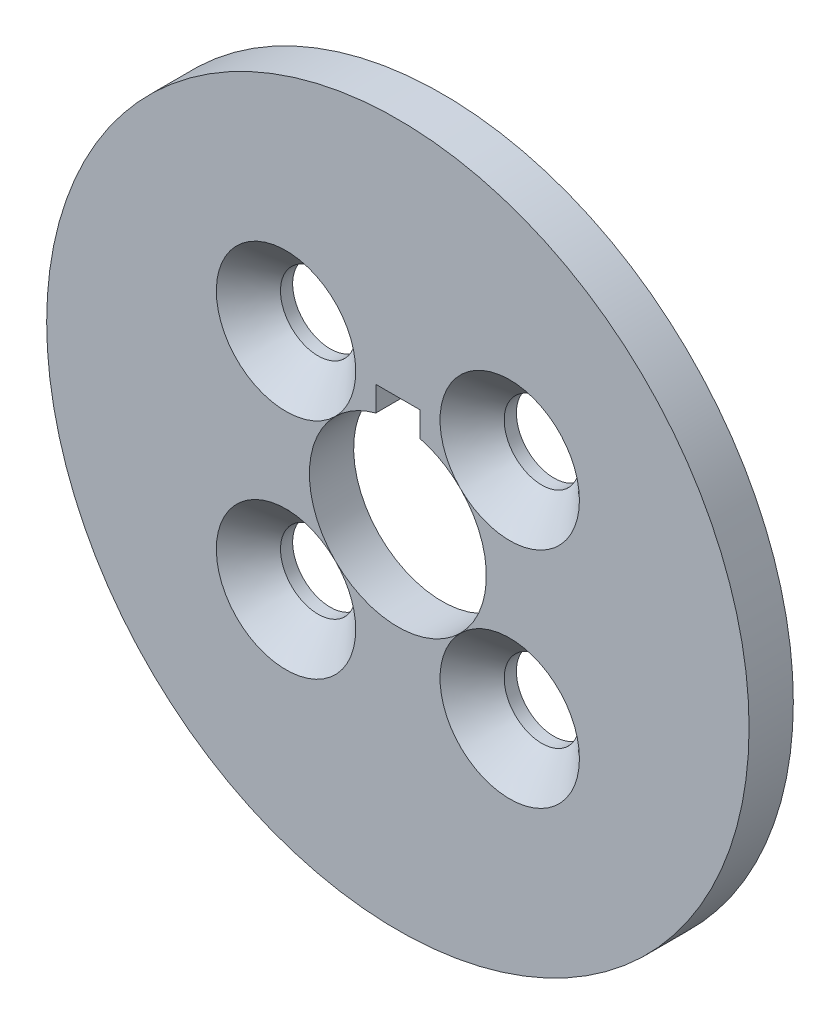
ISO-10303-21;
HEADER;
FILE_DESCRIPTION(('STEP AP214'),'2;1');
FILE_NAME('part.step','',(''),(''),'','','');
FILE_SCHEMA(('AUTOMOTIVE_DESIGN { 1 0 10303 214 1 1 1 1 }'));
ENDSEC;
DATA;
#1=APPLICATION_CONTEXT('core data for automotive mechanical design processes');
#2=APPLICATION_PROTOCOL_DEFINITION('international standard','automotive_design',2000,#1);
#3=PRODUCT_CONTEXT('',#1,'mechanical');
#4=PRODUCT('Part','Part','',(#3));
#5=PRODUCT_RELATED_PRODUCT_CATEGORY('part','',(#4));
#6=PRODUCT_DEFINITION_FORMATION('','',#4);
#7=PRODUCT_DEFINITION_CONTEXT('part definition',#1,'design');
#8=PRODUCT_DEFINITION('design','',#6,#7);
#9=PRODUCT_DEFINITION_SHAPE('','',#8);
#10=(LENGTH_UNIT() NAMED_UNIT(*) SI_UNIT(.MILLI.,.METRE.));
#11=(NAMED_UNIT(*) PLANE_ANGLE_UNIT() SI_UNIT($,.RADIAN.));
#12=(NAMED_UNIT(*) SI_UNIT($,.STERADIAN.) SOLID_ANGLE_UNIT());
#13=UNCERTAINTY_MEASURE_WITH_UNIT(LENGTH_MEASURE(1.E-05),#10,'distance_accuracy_value','');
#14=(GEOMETRIC_REPRESENTATION_CONTEXT(3) GLOBAL_UNCERTAINTY_ASSIGNED_CONTEXT((#13)) GLOBAL_UNIT_ASSIGNED_CONTEXT((#10,
#11,#12)) REPRESENTATION_CONTEXT('',''));
#15=CARTESIAN_POINT('',(0.,0.,0.));
#16=DIRECTION('',(0.,0.,1.));
#17=DIRECTION('',(1.,0.,0.));
#18=AXIS2_PLACEMENT_3D('',#15,#16,#17);
#19=CARTESIAN_POINT('',(-160.606756626317,98.8856314828036,2.));
#20=DIRECTION('',(0.,0.,-1.));
#21=DIRECTION('',(-1.,0.,0.));
#22=AXIS2_PLACEMENT_3D('',#19,#20,#21);
#23=CYLINDRICAL_SURFACE('',#22,15.875);
#24=CARTESIAN_POINT('',(-160.606756626317,98.8856314828036,2.));
#25=DIRECTION('',(0.,0.,-1.));
#26=DIRECTION('',(-1.,0.,0.));
#27=AXIS2_PLACEMENT_3D('',#24,#25,#26);
#28=CIRCLE('',#27,15.875);
#29=CARTESIAN_POINT('',(-176.481756626317,98.8856314828036,2.));
#30=VERTEX_POINT('',#29);
#31=EDGE_CURVE('E11',#30,#30,#28,.T.);
#32=ORIENTED_EDGE('',*,*,#31,.T.);
#33=EDGE_LOOP('',(#32));
#34=FACE_BOUND('',#33,.T.);
#35=CARTESIAN_POINT('',(-160.606756626317,98.8856314828036,0.));
#36=DIRECTION('',(0.,0.,-1.));
#37=DIRECTION('',(-1.,0.,0.));
#38=AXIS2_PLACEMENT_3D('',#35,#36,#37);
#39=CIRCLE('',#38,15.875);
#40=CARTESIAN_POINT('',(-176.481756626317,98.8856314828036,0.));
#41=VERTEX_POINT('',#40);
#42=EDGE_CURVE('E48',#41,#41,#39,.T.);
#43=ORIENTED_EDGE('',*,*,#42,.F.);
#44=EDGE_LOOP('',(#43));
#45=FACE_BOUND('',#44,.T.);
#46=ADVANCED_FACE('F40',(#34,#45),#23,.T.);
#47=CARTESIAN_POINT('',(-144.731756626317,98.8856314828036,2.));
#48=DIRECTION('',(0.,0.,1.));
#49=DIRECTION('',(1.,0.,0.));
#50=AXIS2_PLACEMENT_3D('',#47,#48,#49);
#51=PLANE('',#50);
#52=CARTESIAN_POINT('',(-160.606756626317,98.8856314828036,2.));
#53=DIRECTION('',(0.,0.,1.));
#54=DIRECTION('',(1.,0.,0.));
#55=AXIS2_PLACEMENT_3D('',#52,#53,#54);
#56=CIRCLE('',#55,4.);
#57=CARTESIAN_POINT('',(-163.435183751062,101.714058607551,2.));
#58=VERTEX_POINT('',#57);
#59=CARTESIAN_POINT('',(-163.435183751064,96.0572043580585,2.));
#60=VERTEX_POINT('',#59);
#61=EDGE_CURVE('E115',#58,#60,#56,.T.);
#62=ORIENTED_EDGE('',*,*,#61,.F.);
#63=CARTESIAN_POINT('',(-165.662570111801,103.941444968287,2.));
#64=DIRECTION('',(0.,0.,1.));
#65=DIRECTION('',(1.,0.,0.));
#66=AXIS2_PLACEMENT_3D('',#63,#64,#65);
#67=CIRCLE('',#66,3.15000000000001);
#68=EDGE_CURVE('E56',#58,#58,#67,.T.);
#69=ORIENTED_EDGE('',*,*,#68,.F.);
#70=CARTESIAN_POINT('',(-161.606756626317,102.758614829011,2.));
#71=VERTEX_POINT('',#70);
#72=EDGE_CURVE('E98',#71,#58,#56,.T.);
#73=ORIENTED_EDGE('',*,*,#72,.F.);
#74=DIRECTION('',(0.,1.,0.));
#75=VECTOR('',#74,1.);
#76=CARTESIAN_POINT('',(-161.606756626317,102.758614829011,2.));
#77=LINE('',#76,#75);
#78=CARTESIAN_POINT('',(-161.606756626317,103.885631482804,2.));
#79=VERTEX_POINT('',#78);
#80=EDGE_CURVE('E113',#71,#79,#77,.T.);
#81=ORIENTED_EDGE('',*,*,#80,.T.);
#82=DIRECTION('',(1.,0.,0.));
#83=VECTOR('',#82,1.);
#84=CARTESIAN_POINT('',(-161.606756626317,103.885631482804,2.));
#85=LINE('',#84,#83);
#86=CARTESIAN_POINT('',(-159.606756626317,103.885631482804,2.));
#87=VERTEX_POINT('',#86);
#88=EDGE_CURVE('E123',#79,#87,#85,.T.);
#89=ORIENTED_EDGE('',*,*,#88,.T.);
#90=DIRECTION('',(0.,-1.,0.));
#91=VECTOR('',#90,1.);
#92=CARTESIAN_POINT('',(-159.606756626317,103.885631482804,2.));
#93=LINE('',#92,#91);
#94=CARTESIAN_POINT('',(-159.606756626317,102.758614829011,2.));
#95=VERTEX_POINT('',#94);
#96=EDGE_CURVE('E129',#87,#95,#93,.T.);
#97=ORIENTED_EDGE('',*,*,#96,.T.);
#98=CARTESIAN_POINT('',(-157.77832950157,101.714058607549,2.));
#99=VERTEX_POINT('',#98);
#100=EDGE_CURVE('E261',#99,#95,#56,.T.);
#101=ORIENTED_EDGE('',*,*,#100,.F.);
#102=CARTESIAN_POINT('',(-155.550943140833,103.941444968288,2.));
#103=DIRECTION('',(0.,0.,1.));
#104=DIRECTION('',(1.,0.,0.));
#105=AXIS2_PLACEMENT_3D('',#102,#103,#104);
#106=CIRCLE('',#105,3.14999999999999);
#107=EDGE_CURVE('E61',#99,#99,#106,.T.);
#108=ORIENTED_EDGE('',*,*,#107,.F.);
#109=CARTESIAN_POINT('',(-157.778329501572,96.0572043580567,2.));
#110=VERTEX_POINT('',#109);
#111=EDGE_CURVE('E266',#110,#99,#56,.T.);
#112=ORIENTED_EDGE('',*,*,#111,.F.);
#113=CARTESIAN_POINT('',(-155.550943140833,93.82981799732,2.));
#114=DIRECTION('',(0.,0.,1.));
#115=DIRECTION('',(1.,0.,0.));
#116=AXIS2_PLACEMENT_3D('',#113,#114,#115);
#117=CIRCLE('',#116,3.14999999999999);
#118=EDGE_CURVE('E239',#110,#110,#117,.T.);
#119=ORIENTED_EDGE('',*,*,#118,.F.);
#120=EDGE_CURVE('E117',#60,#110,#56,.T.);
#121=ORIENTED_EDGE('',*,*,#120,.F.);
#122=CARTESIAN_POINT('',(-165.662570111801,93.8298179973198,2.));
#123=DIRECTION('',(0.,0.,1.));
#124=DIRECTION('',(1.,0.,0.));
#125=AXIS2_PLACEMENT_3D('',#122,#123,#124);
#126=CIRCLE('',#125,3.15000000000001);
#127=EDGE_CURVE('E250',#60,#60,#126,.T.);
#128=ORIENTED_EDGE('',*,*,#127,.F.);
#129=EDGE_LOOP('',(#62,#69,#73,#81,#89,#97,#101,#108,#112,#119,#121,#128));
#130=FACE_BOUND('',#129,.T.);
#131=ORIENTED_EDGE('',*,*,#31,.F.);
#132=EDGE_LOOP('',(#131));
#133=FACE_BOUND('',#132,.T.);
#134=ADVANCED_FACE('F110',(#130,#133),#51,.T.);
#135=CARTESIAN_POINT('',(-160.606756626317,98.8856314828036,0.));
#136=DIRECTION('',(0.,0.,-1.));
#137=DIRECTION('',(-1.,0.,0.));
#138=AXIS2_PLACEMENT_3D('',#135,#136,#137);
#139=PLANE('',#138);
#140=CARTESIAN_POINT('',(-165.662570111801,103.941444968287,0.));
#141=DIRECTION('',(0.,0.,1.));
#142=DIRECTION('',(1.,0.,0.));
#143=AXIS2_PLACEMENT_3D('',#140,#141,#142);
#144=CIRCLE('',#143,1.70000000000001);
#145=CARTESIAN_POINT('',(-163.9625701118,103.941444968287,0.));
#146=VERTEX_POINT('',#145);
#147=EDGE_CURVE('E220',#146,#146,#144,.T.);
#148=ORIENTED_EDGE('',*,*,#147,.T.);
#149=EDGE_LOOP('',(#148));
#150=FACE_BOUND('',#149,.T.);
#151=CARTESIAN_POINT('',(-155.550943140833,103.941444968288,0.));
#152=DIRECTION('',(0.,0.,1.));
#153=DIRECTION('',(1.,0.,0.));
#154=AXIS2_PLACEMENT_3D('',#151,#152,#153);
#155=CIRCLE('',#154,1.70000000000001);
#156=CARTESIAN_POINT('',(-153.850943140833,103.941444968288,0.));
#157=VERTEX_POINT('',#156);
#158=EDGE_CURVE('E235',#157,#157,#155,.T.);
#159=ORIENTED_EDGE('',*,*,#158,.T.);
#160=EDGE_LOOP('',(#159));
#161=FACE_BOUND('',#160,.T.);
#162=CARTESIAN_POINT('',(-155.550943140833,93.82981799732,0.));
#163=DIRECTION('',(0.,0.,1.));
#164=DIRECTION('',(1.,0.,0.));
#165=AXIS2_PLACEMENT_3D('',#162,#163,#164);
#166=CIRCLE('',#165,1.70000000000001);
#167=CARTESIAN_POINT('',(-153.850943140832,93.82981799732,0.));
#168=VERTEX_POINT('',#167);
#169=EDGE_CURVE('E246',#168,#168,#166,.T.);
#170=ORIENTED_EDGE('',*,*,#169,.T.);
#171=EDGE_LOOP('',(#170));
#172=FACE_BOUND('',#171,.T.);
#173=CARTESIAN_POINT('',(-165.662570111801,93.8298179973198,0.));
#174=DIRECTION('',(0.,0.,1.));
#175=DIRECTION('',(1.,0.,0.));
#176=AXIS2_PLACEMENT_3D('',#173,#174,#175);
#177=CIRCLE('',#176,1.70000000000001);
#178=CARTESIAN_POINT('',(-163.9625701118,93.8298179973198,0.));
#179=VERTEX_POINT('',#178);
#180=EDGE_CURVE('E258',#179,#179,#177,.T.);
#181=ORIENTED_EDGE('',*,*,#180,.T.);
#182=EDGE_LOOP('',(#181));
#183=FACE_BOUND('',#182,.T.);
#184=CARTESIAN_POINT('',(-160.606756626317,98.8856314828036,0.));
#185=DIRECTION('',(0.,0.,1.));
#186=DIRECTION('',(1.,0.,0.));
#187=AXIS2_PLACEMENT_3D('',#184,#185,#186);
#188=CIRCLE('',#187,4.);
#189=CARTESIAN_POINT('',(-161.606756626317,102.758614829011,0.));
#190=VERTEX_POINT('',#189);
#191=CARTESIAN_POINT('',(-159.606756626317,102.758614829011,0.));
#192=VERTEX_POINT('',#191);
#193=EDGE_CURVE('E100',#190,#192,#188,.T.);
#194=ORIENTED_EDGE('',*,*,#193,.T.);
#195=DIRECTION('',(0.,-1.,0.));
#196=VECTOR('',#195,1.);
#197=CARTESIAN_POINT('',(-159.606756626317,103.885631482804,0.));
#198=LINE('',#197,#196);
#199=CARTESIAN_POINT('',(-159.606756626317,103.885631482804,0.));
#200=VERTEX_POINT('',#199);
#201=EDGE_CURVE('E124',#200,#192,#198,.T.);
#202=ORIENTED_EDGE('',*,*,#201,.F.);
#203=DIRECTION('',(1.,0.,0.));
#204=VECTOR('',#203,1.);
#205=CARTESIAN_POINT('',(-161.606756626317,103.885631482804,0.));
#206=LINE('',#205,#204);
#207=CARTESIAN_POINT('',(-161.606756626317,103.885631482804,0.));
#208=VERTEX_POINT('',#207);
#209=EDGE_CURVE('E132',#208,#200,#206,.T.);
#210=ORIENTED_EDGE('',*,*,#209,.F.);
#211=DIRECTION('',(0.,1.,0.));
#212=VECTOR('',#211,1.);
#213=CARTESIAN_POINT('',(-161.606756626317,102.758614829011,0.));
#214=LINE('',#213,#212);
#215=EDGE_CURVE('E139',#190,#208,#214,.T.);
#216=ORIENTED_EDGE('',*,*,#215,.F.);
#217=EDGE_LOOP('',(#194,#202,#210,#216));
#218=FACE_BOUND('',#217,.T.);
#219=ORIENTED_EDGE('',*,*,#42,.T.);
#220=EDGE_LOOP('',(#219));
#221=FACE_BOUND('',#220,.T.);
#222=ADVANCED_FACE('F156',(#150,#161,#172,#183,#218,#221),#139,.T.);
#223=CARTESIAN_POINT('',(-161.606756626317,102.758614829011,2.));
#224=DIRECTION('',(-1.,0.,0.));
#225=DIRECTION('',(0.,0.,1.));
#226=AXIS2_PLACEMENT_3D('',#223,#224,#225);
#227=PLANE('',#226);
#228=ORIENTED_EDGE('',*,*,#215,.T.);
#229=DIRECTION('',(0.,0.,-1.));
#230=VECTOR('',#229,1.);
#231=CARTESIAN_POINT('',(-161.606756626317,103.885631482804,2.));
#232=LINE('',#231,#230);
#233=EDGE_CURVE('E120',#79,#208,#232,.T.);
#234=ORIENTED_EDGE('',*,*,#233,.F.);
#235=ORIENTED_EDGE('',*,*,#80,.F.);
#236=DIRECTION('',(0.,0.,-1.));
#237=VECTOR('',#236,1.);
#238=CARTESIAN_POINT('',(-161.606756626317,102.758614829011,2.));
#239=LINE('',#238,#237);
#240=EDGE_CURVE('E95',#71,#190,#239,.T.);
#241=ORIENTED_EDGE('',*,*,#240,.T.);
#242=EDGE_LOOP('',(#228,#234,#235,#241));
#243=FACE_BOUND('',#242,.T.);
#244=ADVANCED_FACE('F118',(#243),#227,.F.);
#245=CARTESIAN_POINT('',(-159.606756626317,103.885631482804,2.));
#246=DIRECTION('',(1.,0.,0.));
#247=DIRECTION('',(0.,0.,-1.));
#248=AXIS2_PLACEMENT_3D('',#245,#246,#247);
#249=PLANE('',#248);
#250=ORIENTED_EDGE('',*,*,#201,.T.);
#251=DIRECTION('',(0.,0.,-1.));
#252=VECTOR('',#251,1.);
#253=CARTESIAN_POINT('',(-159.606756626317,102.758614829011,2.));
#254=LINE('',#253,#252);
#255=EDGE_CURVE('E105',#95,#192,#254,.T.);
#256=ORIENTED_EDGE('',*,*,#255,.F.);
#257=ORIENTED_EDGE('',*,*,#96,.F.);
#258=DIRECTION('',(0.,0.,-1.));
#259=VECTOR('',#258,1.);
#260=CARTESIAN_POINT('',(-159.606756626317,103.885631482804,2.));
#261=LINE('',#260,#259);
#262=EDGE_CURVE('E147',#87,#200,#261,.T.);
#263=ORIENTED_EDGE('',*,*,#262,.T.);
#264=EDGE_LOOP('',(#250,#256,#257,#263));
#265=FACE_BOUND('',#264,.T.);
#266=ADVANCED_FACE('F172',(#265),#249,.F.);
#267=CARTESIAN_POINT('',(-161.606756626317,103.885631482804,2.));
#268=DIRECTION('',(0.,1.,0.));
#269=DIRECTION('',(0.,0.,1.));
#270=AXIS2_PLACEMENT_3D('',#267,#268,#269);
#271=PLANE('',#270);
#272=ORIENTED_EDGE('',*,*,#209,.T.);
#273=ORIENTED_EDGE('',*,*,#262,.F.);
#274=ORIENTED_EDGE('',*,*,#88,.F.);
#275=ORIENTED_EDGE('',*,*,#233,.T.);
#276=EDGE_LOOP('',(#272,#273,#274,#275));
#277=FACE_BOUND('',#276,.T.);
#278=ADVANCED_FACE('F173',(#277),#271,.F.);
#279=CARTESIAN_POINT('',(-160.606756626317,98.8856314828036,0.));
#280=DIRECTION('',(0.,0.,1.));
#281=DIRECTION('',(1.,0.,0.));
#282=AXIS2_PLACEMENT_3D('',#279,#280,#281);
#283=CYLINDRICAL_SURFACE('',#282,4.);
#284=ORIENTED_EDGE('',*,*,#72,.T.);
#285=ORIENTED_EDGE('',*,*,#61,.T.);
#286=ORIENTED_EDGE('',*,*,#120,.T.);
#287=ORIENTED_EDGE('',*,*,#111,.T.);
#288=ORIENTED_EDGE('',*,*,#100,.T.);
#289=ORIENTED_EDGE('',*,*,#255,.T.);
#290=ORIENTED_EDGE('',*,*,#193,.F.);
#291=ORIENTED_EDGE('',*,*,#240,.F.);
#292=EDGE_LOOP('',(#284,#285,#286,#287,#288,#289,#290,#291));
#293=FACE_BOUND('',#292,.T.);
#294=ADVANCED_FACE('F97',(#293),#283,.F.);
#295=CARTESIAN_POINT('',(-165.662570111801,93.8298179973198,2.));
#296=DIRECTION('',(0.,0.,1.));
#297=DIRECTION('',(1.,0.,0.));
#298=AXIS2_PLACEMENT_3D('',#295,#296,#297);
#299=CYLINDRICAL_SURFACE('',#298,1.70000000000001);
#300=ORIENTED_EDGE('',*,*,#180,.F.);
#301=EDGE_LOOP('',(#300));
#302=FACE_BOUND('',#301,.T.);
#303=CARTESIAN_POINT('',(-165.662570111801,93.8298179973198,0.550000000000001));
#304=DIRECTION('',(0.,0.,1.));
#305=DIRECTION('',(1.,0.,0.));
#306=AXIS2_PLACEMENT_3D('',#303,#304,#305);
#307=CIRCLE('',#306,1.70000000000001);
#308=CARTESIAN_POINT('',(-163.9625701118,93.8298179973198,0.550000000000001));
#309=VERTEX_POINT('',#308);
#310=EDGE_CURVE('E254',#309,#309,#307,.T.);
#311=ORIENTED_EDGE('',*,*,#310,.T.);
#312=EDGE_LOOP('',(#311));
#313=FACE_BOUND('',#312,.T.);
#314=ADVANCED_FACE('F182',(#302,#313),#299,.F.);
#315=CARTESIAN_POINT('',(-165.662570111801,93.8298179973198,2.));
#316=DIRECTION('',(0.,0.,1.));
#317=DIRECTION('',(1.,0.,0.));
#318=AXIS2_PLACEMENT_3D('',#315,#316,#317);
#319=CONICAL_SURFACE('',#318,3.15000000000001,0.785398163397451);
#320=ORIENTED_EDGE('',*,*,#310,.F.);
#321=EDGE_LOOP('',(#320));
#322=FACE_BOUND('',#321,.T.);
#323=ORIENTED_EDGE('',*,*,#127,.T.);
#324=EDGE_LOOP('',(#323));
#325=FACE_BOUND('',#324,.T.);
#326=ADVANCED_FACE('F185',(#322,#325),#319,.F.);
#327=CARTESIAN_POINT('',(-155.550943140833,93.82981799732,2.));
#328=DIRECTION('',(0.,0.,1.));
#329=DIRECTION('',(1.,0.,0.));
#330=AXIS2_PLACEMENT_3D('',#327,#328,#329);
#331=CYLINDRICAL_SURFACE('',#330,1.70000000000001);
#332=ORIENTED_EDGE('',*,*,#169,.F.);
#333=EDGE_LOOP('',(#332));
#334=FACE_BOUND('',#333,.T.);
#335=CARTESIAN_POINT('',(-155.550943140833,93.82981799732,0.550000000000001));
#336=DIRECTION('',(0.,0.,1.));
#337=DIRECTION('',(1.,0.,0.));
#338=AXIS2_PLACEMENT_3D('',#335,#336,#337);
#339=CIRCLE('',#338,1.70000000000001);
#340=CARTESIAN_POINT('',(-153.850943140832,93.82981799732,0.550000000000001));
#341=VERTEX_POINT('',#340);
#342=EDGE_CURVE('E242',#341,#341,#339,.T.);
#343=ORIENTED_EDGE('',*,*,#342,.T.);
#344=EDGE_LOOP('',(#343));
#345=FACE_BOUND('',#344,.T.);
#346=ADVANCED_FACE('F189',(#334,#345),#331,.F.);
#347=CARTESIAN_POINT('',(-155.550943140833,93.82981799732,2.));
#348=DIRECTION('',(0.,0.,1.));
#349=DIRECTION('',(1.,0.,0.));
#350=AXIS2_PLACEMENT_3D('',#347,#348,#349);
#351=CONICAL_SURFACE('',#350,3.14999999999999,0.785398163397442);
#352=ORIENTED_EDGE('',*,*,#342,.F.);
#353=EDGE_LOOP('',(#352));
#354=FACE_BOUND('',#353,.T.);
#355=ORIENTED_EDGE('',*,*,#118,.T.);
#356=EDGE_LOOP('',(#355));
#357=FACE_BOUND('',#356,.T.);
#358=ADVANCED_FACE('F193',(#354,#357),#351,.F.);
#359=CARTESIAN_POINT('',(-155.550943140833,103.941444968288,2.));
#360=DIRECTION('',(0.,0.,1.));
#361=DIRECTION('',(1.,0.,0.));
#362=AXIS2_PLACEMENT_3D('',#359,#360,#361);
#363=CYLINDRICAL_SURFACE('',#362,1.70000000000001);
#364=ORIENTED_EDGE('',*,*,#158,.F.);
#365=EDGE_LOOP('',(#364));
#366=FACE_BOUND('',#365,.T.);
#367=CARTESIAN_POINT('',(-155.550943140833,103.941444968288,0.550000000000001));
#368=DIRECTION('',(0.,0.,1.));
#369=DIRECTION('',(1.,0.,0.));
#370=AXIS2_PLACEMENT_3D('',#367,#368,#369);
#371=CIRCLE('',#370,1.70000000000001);
#372=CARTESIAN_POINT('',(-153.850943140833,103.941444968288,0.550000000000001));
#373=VERTEX_POINT('',#372);
#374=EDGE_CURVE('E231',#373,#373,#371,.T.);
#375=ORIENTED_EDGE('',*,*,#374,.T.);
#376=EDGE_LOOP('',(#375));
#377=FACE_BOUND('',#376,.T.);
#378=ADVANCED_FACE('F197',(#366,#377),#363,.F.);
#379=CARTESIAN_POINT('',(-155.550943140833,103.941444968288,2.));
#380=DIRECTION('',(0.,0.,1.));
#381=DIRECTION('',(1.,0.,0.));
#382=AXIS2_PLACEMENT_3D('',#379,#380,#381);
#383=CONICAL_SURFACE('',#382,3.14999999999999,0.785398163397442);
#384=ORIENTED_EDGE('',*,*,#374,.F.);
#385=EDGE_LOOP('',(#384));
#386=FACE_BOUND('',#385,.T.);
#387=ORIENTED_EDGE('',*,*,#107,.T.);
#388=EDGE_LOOP('',(#387));
#389=FACE_BOUND('',#388,.T.);
#390=ADVANCED_FACE('F201',(#386,#389),#383,.F.);
#391=CARTESIAN_POINT('',(-165.662570111801,103.941444968287,2.));
#392=DIRECTION('',(0.,0.,1.));
#393=DIRECTION('',(1.,0.,0.));
#394=AXIS2_PLACEMENT_3D('',#391,#392,#393);
#395=CYLINDRICAL_SURFACE('',#394,1.70000000000001);
#396=ORIENTED_EDGE('',*,*,#147,.F.);
#397=EDGE_LOOP('',(#396));
#398=FACE_BOUND('',#397,.T.);
#399=CARTESIAN_POINT('',(-165.662570111801,103.941444968287,0.550000000000001));
#400=DIRECTION('',(0.,0.,1.));
#401=DIRECTION('',(1.,0.,0.));
#402=AXIS2_PLACEMENT_3D('',#399,#400,#401);
#403=CIRCLE('',#402,1.70000000000001);
#404=CARTESIAN_POINT('',(-163.9625701118,103.941444968287,0.550000000000001));
#405=VERTEX_POINT('',#404);
#406=EDGE_CURVE('E217',#405,#405,#403,.T.);
#407=ORIENTED_EDGE('',*,*,#406,.T.);
#408=EDGE_LOOP('',(#407));
#409=FACE_BOUND('',#408,.T.);
#410=ADVANCED_FACE('F205',(#398,#409),#395,.F.);
#411=CARTESIAN_POINT('',(-165.662570111801,103.941444968287,2.));
#412=DIRECTION('',(0.,0.,1.));
#413=DIRECTION('',(1.,0.,0.));
#414=AXIS2_PLACEMENT_3D('',#411,#412,#413);
#415=CONICAL_SURFACE('',#414,3.15000000000001,0.785398163397451);
#416=ORIENTED_EDGE('',*,*,#406,.F.);
#417=EDGE_LOOP('',(#416));
#418=FACE_BOUND('',#417,.T.);
#419=ORIENTED_EDGE('',*,*,#68,.T.);
#420=EDGE_LOOP('',(#419));
#421=FACE_BOUND('',#420,.T.);
#422=ADVANCED_FACE('F209',(#418,#421),#415,.F.);
#423=CLOSED_SHELL('',(#46,#134,#222,#244,#266,#278,#294,#314,#326,#346,#358,#378,#390,#410,#422));
#424=MANIFOLD_SOLID_BREP('B2',#423);
#425=ADVANCED_BREP_SHAPE_REPRESENTATION('',(#18,#424),#14);
#426=SHAPE_DEFINITION_REPRESENTATION(#9,#425);
ENDSEC;
END-ISO-10303-21;
